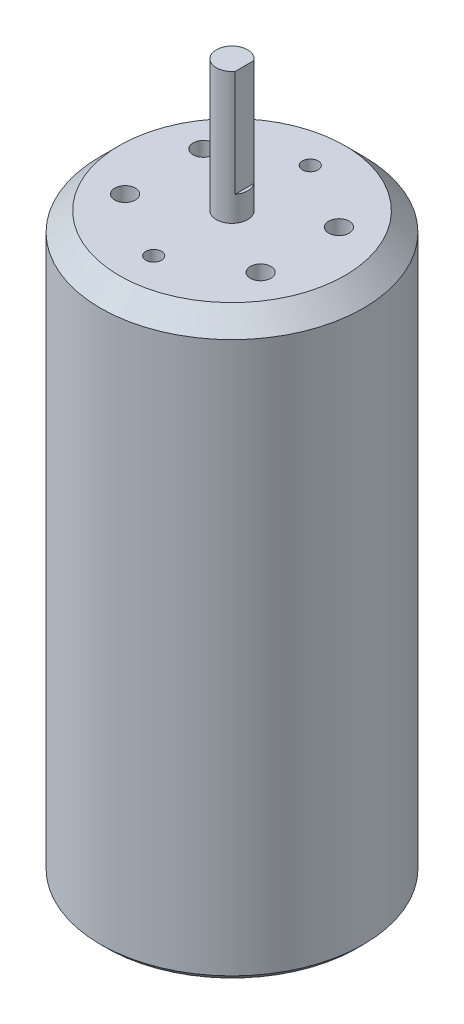
ISO-10303-21;
HEADER;
FILE_DESCRIPTION(('STEP AP214'),'2;1');
FILE_NAME('part.step','',(''),(''),'','','');
FILE_SCHEMA(('AUTOMOTIVE_DESIGN { 1 0 10303 214 1 1 1 1 }'));
ENDSEC;
DATA;
#1=APPLICATION_CONTEXT('core data for automotive mechanical design processes');
#2=APPLICATION_PROTOCOL_DEFINITION('international standard','automotive_design',2000,#1);
#3=PRODUCT_CONTEXT('',#1,'mechanical');
#4=PRODUCT('Part','Part','',(#3));
#5=PRODUCT_RELATED_PRODUCT_CATEGORY('part','',(#4));
#6=PRODUCT_DEFINITION_FORMATION('','',#4);
#7=PRODUCT_DEFINITION_CONTEXT('part definition',#1,'design');
#8=PRODUCT_DEFINITION('design','',#6,#7);
#9=PRODUCT_DEFINITION_SHAPE('','',#8);
#10=(LENGTH_UNIT() NAMED_UNIT(*) SI_UNIT(.MILLI.,.METRE.));
#11=(NAMED_UNIT(*) PLANE_ANGLE_UNIT() SI_UNIT($,.RADIAN.));
#12=(NAMED_UNIT(*) SI_UNIT($,.STERADIAN.) SOLID_ANGLE_UNIT());
#13=UNCERTAINTY_MEASURE_WITH_UNIT(LENGTH_MEASURE(1.E-05),#10,'distance_accuracy_value','');
#14=(GEOMETRIC_REPRESENTATION_CONTEXT(3) GLOBAL_UNCERTAINTY_ASSIGNED_CONTEXT((#13)) GLOBAL_UNIT_ASSIGNED_CONTEXT((#10,
#11,#12)) REPRESENTATION_CONTEXT('',''));
#15=CARTESIAN_POINT('',(0.,0.,0.));
#16=DIRECTION('',(0.,0.,1.));
#17=DIRECTION('',(1.,0.,0.));
#18=AXIS2_PLACEMENT_3D('',#15,#16,#17);
#19=CARTESIAN_POINT('',(0.,0.,0.));
#20=DIRECTION('',(0.,-1.,0.));
#21=DIRECTION('',(0.,0.,-1.));
#22=AXIS2_PLACEMENT_3D('',#19,#20,#21);
#23=CYLINDRICAL_SURFACE('',#22,2.5);
#24=CARTESIAN_POINT('',(0.,92.,0.));
#25=DIRECTION('',(0.,-1.,0.));
#26=DIRECTION('',(0.,0.,-1.));
#27=AXIS2_PLACEMENT_3D('',#24,#25,#26);
#28=CIRCLE('',#27,2.5);
#29=CARTESIAN_POINT('',(0.,92.,-2.5));
#30=VERTEX_POINT('',#29);
#31=EDGE_CURVE('E164',#30,#30,#28,.T.);
#32=ORIENTED_EDGE('',*,*,#31,.F.);
#33=EDGE_LOOP('',(#32));
#34=FACE_BOUND('',#33,.T.);
#35=CARTESIAN_POINT('',(0.,96.,0.));
#36=DIRECTION('',(0.,1.,0.));
#37=DIRECTION('',(0.,0.,1.));
#38=AXIS2_PLACEMENT_3D('',#35,#36,#37);
#39=CIRCLE('',#38,2.5);
#40=CARTESIAN_POINT('',(2.,96.,1.5));
#41=VERTEX_POINT('',#40);
#42=CARTESIAN_POINT('',(2.,96.,-1.5));
#43=VERTEX_POINT('',#42);
#44=EDGE_CURVE('E66',#41,#43,#39,.T.);
#45=ORIENTED_EDGE('',*,*,#44,.F.);
#46=DIRECTION('',(0.,1.,0.));
#47=VECTOR('',#46,1.);
#48=CARTESIAN_POINT('',(2.,96.,1.5));
#49=LINE('',#48,#47);
#50=CARTESIAN_POINT('',(2.,113.,1.5));
#51=VERTEX_POINT('',#50);
#52=EDGE_CURVE('E161',#41,#51,#49,.T.);
#53=ORIENTED_EDGE('',*,*,#52,.T.);
#54=CARTESIAN_POINT('',(0.,113.,0.));
#55=DIRECTION('',(0.,-1.,0.));
#56=DIRECTION('',(0.,0.,-1.));
#57=AXIS2_PLACEMENT_3D('',#54,#55,#56);
#58=CIRCLE('',#57,2.5);
#59=CARTESIAN_POINT('',(2.,113.,-1.5));
#60=VERTEX_POINT('',#59);
#61=EDGE_CURVE('E174',#51,#60,#58,.T.);
#62=ORIENTED_EDGE('',*,*,#61,.T.);
#63=DIRECTION('',(0.,1.,0.));
#64=VECTOR('',#63,1.);
#65=CARTESIAN_POINT('',(2.,96.,-1.5));
#66=LINE('',#65,#64);
#67=EDGE_CURVE('E76',#43,#60,#66,.T.);
#68=ORIENTED_EDGE('',*,*,#67,.F.);
#69=EDGE_LOOP('',(#45,#53,#62,#68));
#70=FACE_BOUND('',#69,.T.);
#71=ADVANCED_FACE('F46',(#34,#70),#23,.T.);
#72=CARTESIAN_POINT('',(21.,0.,0.));
#73=DIRECTION('',(0.,-1.,0.));
#74=DIRECTION('',(0.,0.,-1.));
#75=AXIS2_PLACEMENT_3D('',#72,#73,#74);
#76=PLANE('',#75);
#77=CARTESIAN_POINT('',(0.,0.,0.));
#78=DIRECTION('',(0.,-1.,0.));
#79=DIRECTION('',(0.,0.,-1.));
#80=AXIS2_PLACEMENT_3D('',#77,#78,#79);
#81=CIRCLE('',#80,20.);
#82=CARTESIAN_POINT('',(0.,0.,-20.));
#83=VERTEX_POINT('',#82);
#84=EDGE_CURVE('E57',#83,#83,#81,.T.);
#85=ORIENTED_EDGE('',*,*,#84,.T.);
#86=EDGE_LOOP('',(#85));
#87=FACE_BOUND('',#86,.T.);
#88=ADVANCED_FACE('F189',(#87),#76,.T.);
#89=CARTESIAN_POINT('',(0.,113.,0.));
#90=DIRECTION('',(0.,1.,0.));
#91=DIRECTION('',(0.,0.,1.));
#92=AXIS2_PLACEMENT_3D('',#89,#90,#91);
#93=PLANE('',#92);
#94=DIRECTION('',(0.,0.,1.));
#95=VECTOR('',#94,1.);
#96=CARTESIAN_POINT('',(2.,113.,1.5));
#97=LINE('',#96,#95);
#98=EDGE_CURVE('E152',#60,#51,#97,.T.);
#99=ORIENTED_EDGE('',*,*,#98,.F.);
#100=ORIENTED_EDGE('',*,*,#61,.F.);
#101=EDGE_LOOP('',(#99,#100));
#102=FACE_BOUND('',#101,.T.);
#103=ADVANCED_FACE('F204',(#102),#93,.T.);
#104=CARTESIAN_POINT('',(2.5,92.,0.));
#105=DIRECTION('',(0.,1.,0.));
#106=DIRECTION('',(0.,0.,1.));
#107=AXIS2_PLACEMENT_3D('',#104,#105,#106);
#108=PLANE('',#107);
#109=CARTESIAN_POINT('',(0.,92.,0.));
#110=DIRECTION('',(0.,1.,0.));
#111=DIRECTION('',(0.,0.,1.));
#112=AXIS2_PLACEMENT_3D('',#109,#110,#111);
#113=CIRCLE('',#112,18.);
#114=CARTESIAN_POINT('',(0.,92.,18.));
#115=VERTEX_POINT('',#114);
#116=EDGE_CURVE('E178',#115,#115,#113,.T.);
#117=ORIENTED_EDGE('',*,*,#116,.T.);
#118=EDGE_LOOP('',(#117));
#119=FACE_BOUND('',#118,.T.);
#120=CARTESIAN_POINT('',(-10.8253175473055,92.,-6.25000000000002));
#121=DIRECTION('',(0.,1.,0.));
#122=DIRECTION('',(0.,0.,1.));
#123=AXIS2_PLACEMENT_3D('',#120,#121,#122);
#124=CIRCLE('',#123,1.65);
#125=CARTESIAN_POINT('',(-10.8253175473055,92.,-4.60000000000002));
#126=VERTEX_POINT('',#125);
#127=EDGE_CURVE('E108',#126,#126,#124,.T.);
#128=ORIENTED_EDGE('',*,*,#127,.F.);
#129=EDGE_LOOP('',(#128));
#130=FACE_BOUND('',#129,.T.);
#131=CARTESIAN_POINT('',(-10.8253175473055,92.,6.25000000000002));
#132=DIRECTION('',(0.,1.,0.));
#133=DIRECTION('',(0.,0.,1.));
#134=AXIS2_PLACEMENT_3D('',#131,#132,#133);
#135=CIRCLE('',#134,1.65);
#136=CARTESIAN_POINT('',(-10.8253175473055,92.,7.90000000000001));
#137=VERTEX_POINT('',#136);
#138=EDGE_CURVE('E107',#137,#137,#135,.T.);
#139=ORIENTED_EDGE('',*,*,#138,.F.);
#140=EDGE_LOOP('',(#139));
#141=FACE_BOUND('',#140,.T.);
#142=CARTESIAN_POINT('',(10.8253175473055,92.,6.25000000000002));
#143=DIRECTION('',(0.,1.,0.));
#144=DIRECTION('',(0.,0.,1.));
#145=AXIS2_PLACEMENT_3D('',#142,#143,#144);
#146=CIRCLE('',#145,1.65);
#147=CARTESIAN_POINT('',(10.8253175473055,92.,7.90000000000001));
#148=VERTEX_POINT('',#147);
#149=EDGE_CURVE('E121',#148,#148,#146,.T.);
#150=ORIENTED_EDGE('',*,*,#149,.F.);
#151=EDGE_LOOP('',(#150));
#152=FACE_BOUND('',#151,.T.);
#153=CARTESIAN_POINT('',(10.8253175473055,92.,-6.25000000000002));
#154=DIRECTION('',(0.,1.,0.));
#155=DIRECTION('',(0.,0.,1.));
#156=AXIS2_PLACEMENT_3D('',#153,#154,#155);
#157=CIRCLE('',#156,1.65);
#158=CARTESIAN_POINT('',(10.8253175473055,92.,-4.60000000000002));
#159=VERTEX_POINT('',#158);
#160=EDGE_CURVE('E128',#159,#159,#157,.T.);
#161=ORIENTED_EDGE('',*,*,#160,.F.);
#162=EDGE_LOOP('',(#161));
#163=FACE_BOUND('',#162,.T.);
#164=CARTESIAN_POINT('',(0.,92.,-12.5));
#165=DIRECTION('',(0.,1.,0.));
#166=DIRECTION('',(0.,0.,1.));
#167=AXIS2_PLACEMENT_3D('',#164,#165,#166);
#168=CIRCLE('',#167,1.24999999999999);
#169=CARTESIAN_POINT('',(0.,92.,-11.25));
#170=VERTEX_POINT('',#169);
#171=EDGE_CURVE('E140',#170,#170,#168,.T.);
#172=ORIENTED_EDGE('',*,*,#171,.F.);
#173=EDGE_LOOP('',(#172));
#174=FACE_BOUND('',#173,.T.);
#175=CARTESIAN_POINT('',(0.,92.,12.5));
#176=DIRECTION('',(0.,1.,0.));
#177=DIRECTION('',(0.,0.,1.));
#178=AXIS2_PLACEMENT_3D('',#175,#176,#177);
#179=CIRCLE('',#178,1.24999999999999);
#180=CARTESIAN_POINT('',(0.,92.,13.75));
#181=VERTEX_POINT('',#180);
#182=EDGE_CURVE('E148',#181,#181,#179,.T.);
#183=ORIENTED_EDGE('',*,*,#182,.F.);
#184=EDGE_LOOP('',(#183));
#185=FACE_BOUND('',#184,.T.);
#186=ORIENTED_EDGE('',*,*,#31,.T.);
#187=EDGE_LOOP('',(#186));
#188=FACE_BOUND('',#187,.T.);
#189=ADVANCED_FACE('F209',(#119,#130,#141,#152,#163,#174,#185,#188),#108,.T.);
#190=CARTESIAN_POINT('',(0.,0.,0.));
#191=DIRECTION('',(0.,-1.,0.));
#192=DIRECTION('',(0.,0.,-1.));
#193=AXIS2_PLACEMENT_3D('',#190,#191,#192);
#194=CYLINDRICAL_SURFACE('',#193,21.);
#195=CARTESIAN_POINT('',(0.,1.,0.));
#196=DIRECTION('',(0.,-1.,0.));
#197=DIRECTION('',(0.,0.,-1.));
#198=AXIS2_PLACEMENT_3D('',#195,#196,#197);
#199=CIRCLE('',#198,21.);
#200=CARTESIAN_POINT('',(0.,1.,-21.));
#201=VERTEX_POINT('',#200);
#202=EDGE_CURVE('E11',#201,#201,#199,.F.);
#203=ORIENTED_EDGE('',*,*,#202,.T.);
#204=EDGE_LOOP('',(#203));
#205=FACE_BOUND('',#204,.T.);
#206=CARTESIAN_POINT('',(0.,89.,0.));
#207=DIRECTION('',(0.,1.,0.));
#208=DIRECTION('',(0.,0.,1.));
#209=AXIS2_PLACEMENT_3D('',#206,#207,#208);
#210=CIRCLE('',#209,21.);
#211=CARTESIAN_POINT('',(0.,89.,21.));
#212=VERTEX_POINT('',#211);
#213=EDGE_CURVE('E172',#212,#212,#210,.F.);
#214=ORIENTED_EDGE('',*,*,#213,.T.);
#215=EDGE_LOOP('',(#214));
#216=FACE_BOUND('',#215,.T.);
#217=ADVANCED_FACE('F225',(#205,#216),#194,.T.);
#218=CARTESIAN_POINT('',(2.,96.,1.5));
#219=DIRECTION('',(-1.,0.,0.));
#220=DIRECTION('',(0.,0.,1.));
#221=AXIS2_PLACEMENT_3D('',#218,#219,#220);
#222=PLANE('',#221);
#223=ORIENTED_EDGE('',*,*,#98,.T.);
#224=ORIENTED_EDGE('',*,*,#52,.F.);
#225=DIRECTION('',(0.,0.,1.));
#226=VECTOR('',#225,1.);
#227=CARTESIAN_POINT('',(2.,96.,1.5));
#228=LINE('',#227,#226);
#229=EDGE_CURVE('E61',#43,#41,#228,.T.);
#230=ORIENTED_EDGE('',*,*,#229,.F.);
#231=ORIENTED_EDGE('',*,*,#67,.T.);
#232=EDGE_LOOP('',(#223,#224,#230,#231));
#233=FACE_BOUND('',#232,.T.);
#234=ADVANCED_FACE('F223',(#233),#222,.F.);
#235=CARTESIAN_POINT('',(0.,96.,0.));
#236=DIRECTION('',(0.,1.,0.));
#237=DIRECTION('',(0.,0.,1.));
#238=AXIS2_PLACEMENT_3D('',#235,#236,#237);
#239=PLANE('',#238);
#240=ORIENTED_EDGE('',*,*,#44,.T.);
#241=ORIENTED_EDGE('',*,*,#229,.T.);
#242=EDGE_LOOP('',(#240,#241));
#243=FACE_BOUND('',#242,.T.);
#244=ADVANCED_FACE('F229',(#243),#239,.T.);
#245=CARTESIAN_POINT('',(0.,82.7510757737845,12.5));
#246=DIRECTION('',(0.,1.,0.));
#247=DIRECTION('',(0.,0.,1.));
#248=AXIS2_PLACEMENT_3D('',#245,#246,#247);
#249=CONICAL_SURFACE('',#248,1.25,1.02974425867666);
#250=CARTESIAN_POINT('',(0.,82.,12.5));
#251=VERTEX_POINT('',#250);
#252=VERTEX_LOOP('',#251);
#253=FACE_BOUND('',#252,.T.);
#254=CARTESIAN_POINT('',(0.,82.7510757737845,12.5));
#255=DIRECTION('',(0.,1.,0.));
#256=DIRECTION('',(0.,0.,1.));
#257=AXIS2_PLACEMENT_3D('',#254,#255,#256);
#258=CIRCLE('',#257,1.25);
#259=CARTESIAN_POINT('',(0.,82.7510757737845,13.75));
#260=VERTEX_POINT('',#259);
#261=EDGE_CURVE('E147',#260,#260,#258,.T.);
#262=ORIENTED_EDGE('',*,*,#261,.T.);
#263=EDGE_LOOP('',(#262));
#264=FACE_BOUND('',#263,.T.);
#265=ADVANCED_FACE('F234',(#253,#264),#249,.F.);
#266=CARTESIAN_POINT('',(0.,92.,12.5));
#267=DIRECTION('',(0.,1.,0.));
#268=DIRECTION('',(0.,0.,1.));
#269=AXIS2_PLACEMENT_3D('',#266,#267,#268);
#270=CYLINDRICAL_SURFACE('',#269,1.24999999999999);
#271=ORIENTED_EDGE('',*,*,#261,.F.);
#272=EDGE_LOOP('',(#271));
#273=FACE_BOUND('',#272,.T.);
#274=ORIENTED_EDGE('',*,*,#182,.T.);
#275=EDGE_LOOP('',(#274));
#276=FACE_BOUND('',#275,.T.);
#277=ADVANCED_FACE('F240',(#273,#276),#270,.F.);
#278=CARTESIAN_POINT('',(0.,82.7510757737845,-12.5));
#279=DIRECTION('',(0.,1.,0.));
#280=DIRECTION('',(0.,0.,1.));
#281=AXIS2_PLACEMENT_3D('',#278,#279,#280);
#282=CONICAL_SURFACE('',#281,1.25,1.02974425867666);
#283=CARTESIAN_POINT('',(0.,82.,-12.5));
#284=VERTEX_POINT('',#283);
#285=VERTEX_LOOP('',#284);
#286=FACE_BOUND('',#285,.T.);
#287=CARTESIAN_POINT('',(0.,82.7510757737845,-12.5));
#288=DIRECTION('',(0.,1.,0.));
#289=DIRECTION('',(0.,0.,1.));
#290=AXIS2_PLACEMENT_3D('',#287,#288,#289);
#291=CIRCLE('',#290,1.25);
#292=CARTESIAN_POINT('',(0.,82.7510757737845,-11.25));
#293=VERTEX_POINT('',#292);
#294=EDGE_CURVE('E142',#293,#293,#291,.T.);
#295=ORIENTED_EDGE('',*,*,#294,.T.);
#296=EDGE_LOOP('',(#295));
#297=FACE_BOUND('',#296,.T.);
#298=ADVANCED_FACE('F238',(#286,#297),#282,.F.);
#299=CARTESIAN_POINT('',(0.,92.,-12.5));
#300=DIRECTION('',(0.,1.,0.));
#301=DIRECTION('',(0.,0.,1.));
#302=AXIS2_PLACEMENT_3D('',#299,#300,#301);
#303=CYLINDRICAL_SURFACE('',#302,1.24999999999999);
#304=ORIENTED_EDGE('',*,*,#294,.F.);
#305=EDGE_LOOP('',(#304));
#306=FACE_BOUND('',#305,.T.);
#307=ORIENTED_EDGE('',*,*,#171,.T.);
#308=EDGE_LOOP('',(#307));
#309=FACE_BOUND('',#308,.T.);
#310=ADVANCED_FACE('F243',(#306,#309),#303,.F.);
#311=CARTESIAN_POINT('',(10.8253175473055,82.9914200213955,-6.25000000000002));
#312=DIRECTION('',(0.,1.,0.));
#313=DIRECTION('',(0.,0.,1.));
#314=AXIS2_PLACEMENT_3D('',#311,#312,#313);
#315=CONICAL_SURFACE('',#314,1.65,1.02974425867665);
#316=CARTESIAN_POINT('',(10.8253175473055,82.,-6.25000000000002));
#317=VERTEX_POINT('',#316);
#318=VERTEX_LOOP('',#317);
#319=FACE_BOUND('',#318,.T.);
#320=CARTESIAN_POINT('',(10.8253175473055,82.9914200213955,-6.25000000000002));
#321=DIRECTION('',(0.,1.,0.));
#322=DIRECTION('',(0.,0.,1.));
#323=AXIS2_PLACEMENT_3D('',#320,#321,#322);
#324=CIRCLE('',#323,1.65);
#325=CARTESIAN_POINT('',(10.8253175473055,82.9914200213955,-4.60000000000002));
#326=VERTEX_POINT('',#325);
#327=EDGE_CURVE('E133',#326,#326,#324,.T.);
#328=ORIENTED_EDGE('',*,*,#327,.T.);
#329=EDGE_LOOP('',(#328));
#330=FACE_BOUND('',#329,.T.);
#331=ADVANCED_FACE('F246',(#319,#330),#315,.F.);
#332=CARTESIAN_POINT('',(10.8253175473055,92.,-6.25000000000002));
#333=DIRECTION('',(0.,1.,0.));
#334=DIRECTION('',(0.,0.,1.));
#335=AXIS2_PLACEMENT_3D('',#332,#333,#334);
#336=CYLINDRICAL_SURFACE('',#335,1.65);
#337=ORIENTED_EDGE('',*,*,#327,.F.);
#338=EDGE_LOOP('',(#337));
#339=FACE_BOUND('',#338,.T.);
#340=ORIENTED_EDGE('',*,*,#160,.T.);
#341=EDGE_LOOP('',(#340));
#342=FACE_BOUND('',#341,.T.);
#343=ADVANCED_FACE('F253',(#339,#342),#336,.F.);
#344=CARTESIAN_POINT('',(10.8253175473055,82.9914200213955,6.25000000000002));
#345=DIRECTION('',(0.,1.,0.));
#346=DIRECTION('',(0.,0.,1.));
#347=AXIS2_PLACEMENT_3D('',#344,#345,#346);
#348=CONICAL_SURFACE('',#347,1.65,1.02974425867665);
#349=CARTESIAN_POINT('',(10.8253175473055,82.,6.25000000000002));
#350=VERTEX_POINT('',#349);
#351=VERTEX_LOOP('',#350);
#352=FACE_BOUND('',#351,.T.);
#353=CARTESIAN_POINT('',(10.8253175473055,82.9914200213955,6.25000000000002));
#354=DIRECTION('',(0.,1.,0.));
#355=DIRECTION('',(0.,0.,1.));
#356=AXIS2_PLACEMENT_3D('',#353,#354,#355);
#357=CIRCLE('',#356,1.65);
#358=CARTESIAN_POINT('',(10.8253175473055,82.9914200213955,7.90000000000001));
#359=VERTEX_POINT('',#358);
#360=EDGE_CURVE('E127',#359,#359,#357,.T.);
#361=ORIENTED_EDGE('',*,*,#360,.T.);
#362=EDGE_LOOP('',(#361));
#363=FACE_BOUND('',#362,.T.);
#364=ADVANCED_FACE('F254',(#352,#363),#348,.F.);
#365=CARTESIAN_POINT('',(10.8253175473055,92.,6.25000000000002));
#366=DIRECTION('',(0.,1.,0.));
#367=DIRECTION('',(0.,0.,1.));
#368=AXIS2_PLACEMENT_3D('',#365,#366,#367);
#369=CYLINDRICAL_SURFACE('',#368,1.65);
#370=ORIENTED_EDGE('',*,*,#360,.F.);
#371=EDGE_LOOP('',(#370));
#372=FACE_BOUND('',#371,.T.);
#373=ORIENTED_EDGE('',*,*,#149,.T.);
#374=EDGE_LOOP('',(#373));
#375=FACE_BOUND('',#374,.T.);
#376=ADVANCED_FACE('F259',(#372,#375),#369,.F.);
#377=CARTESIAN_POINT('',(-10.8253175473055,82.9914200213955,6.25000000000002));
#378=DIRECTION('',(0.,1.,0.));
#379=DIRECTION('',(0.,0.,1.));
#380=AXIS2_PLACEMENT_3D('',#377,#378,#379);
#381=CONICAL_SURFACE('',#380,1.65,1.02974425867665);
#382=CARTESIAN_POINT('',(-10.8253175473055,82.,6.25000000000002));
#383=VERTEX_POINT('',#382);
#384=VERTEX_LOOP('',#383);
#385=FACE_BOUND('',#384,.T.);
#386=CARTESIAN_POINT('',(-10.8253175473055,82.9914200213955,6.25000000000002));
#387=DIRECTION('',(0.,1.,0.));
#388=DIRECTION('',(0.,0.,1.));
#389=AXIS2_PLACEMENT_3D('',#386,#387,#388);
#390=CIRCLE('',#389,1.65);
#391=CARTESIAN_POINT('',(-10.8253175473055,82.9914200213955,7.90000000000001));
#392=VERTEX_POINT('',#391);
#393=EDGE_CURVE('E111',#392,#392,#390,.T.);
#394=ORIENTED_EDGE('',*,*,#393,.T.);
#395=EDGE_LOOP('',(#394));
#396=FACE_BOUND('',#395,.T.);
#397=ADVANCED_FACE('F263',(#385,#396),#381,.F.);
#398=CARTESIAN_POINT('',(-10.8253175473055,92.,6.25000000000002));
#399=DIRECTION('',(0.,1.,0.));
#400=DIRECTION('',(0.,0.,1.));
#401=AXIS2_PLACEMENT_3D('',#398,#399,#400);
#402=CYLINDRICAL_SURFACE('',#401,1.65);
#403=ORIENTED_EDGE('',*,*,#393,.F.);
#404=EDGE_LOOP('',(#403));
#405=FACE_BOUND('',#404,.T.);
#406=ORIENTED_EDGE('',*,*,#138,.T.);
#407=EDGE_LOOP('',(#406));
#408=FACE_BOUND('',#407,.T.);
#409=ADVANCED_FACE('F101',(#405,#408),#402,.F.);
#410=CARTESIAN_POINT('',(-10.8253175473055,82.9914200213955,-6.25000000000002));
#411=DIRECTION('',(0.,1.,0.));
#412=DIRECTION('',(0.,0.,1.));
#413=AXIS2_PLACEMENT_3D('',#410,#411,#412);
#414=CONICAL_SURFACE('',#413,1.65,1.02974425867665);
#415=CARTESIAN_POINT('',(-10.8253175473055,82.,-6.25000000000002));
#416=VERTEX_POINT('',#415);
#417=VERTEX_LOOP('',#416);
#418=FACE_BOUND('',#417,.T.);
#419=CARTESIAN_POINT('',(-10.8253175473055,82.9914200213955,-6.25000000000002));
#420=DIRECTION('',(0.,1.,0.));
#421=DIRECTION('',(0.,0.,1.));
#422=AXIS2_PLACEMENT_3D('',#419,#420,#421);
#423=CIRCLE('',#422,1.65);
#424=CARTESIAN_POINT('',(-10.8253175473055,82.9914200213955,-4.60000000000002));
#425=VERTEX_POINT('',#424);
#426=EDGE_CURVE('E104',#425,#425,#423,.T.);
#427=ORIENTED_EDGE('',*,*,#426,.T.);
#428=EDGE_LOOP('',(#427));
#429=FACE_BOUND('',#428,.T.);
#430=ADVANCED_FACE('F100',(#418,#429),#414,.F.);
#431=CARTESIAN_POINT('',(-10.8253175473055,92.,-6.25000000000002));
#432=DIRECTION('',(0.,1.,0.));
#433=DIRECTION('',(0.,0.,1.));
#434=AXIS2_PLACEMENT_3D('',#431,#432,#433);
#435=CYLINDRICAL_SURFACE('',#434,1.65);
#436=ORIENTED_EDGE('',*,*,#426,.F.);
#437=EDGE_LOOP('',(#436));
#438=FACE_BOUND('',#437,.T.);
#439=ORIENTED_EDGE('',*,*,#127,.T.);
#440=EDGE_LOOP('',(#439));
#441=FACE_BOUND('',#440,.T.);
#442=ADVANCED_FACE('F99',(#438,#441),#435,.F.);
#443=CARTESIAN_POINT('',(0.,89.,0.));
#444=DIRECTION('',(0.,-1.,0.));
#445=DIRECTION('',(0.,0.,-1.));
#446=AXIS2_PLACEMENT_3D('',#443,#444,#445);
#447=CONICAL_SURFACE('',#446,21.,0.78539816339745);
#448=ORIENTED_EDGE('',*,*,#116,.F.);
#449=EDGE_LOOP('',(#448));
#450=FACE_BOUND('',#449,.T.);
#451=ORIENTED_EDGE('',*,*,#213,.F.);
#452=EDGE_LOOP('',(#451));
#453=FACE_BOUND('',#452,.T.);
#454=ADVANCED_FACE('F188',(#450,#453),#447,.T.);
#455=CARTESIAN_POINT('',(0.,0.,0.));
#456=DIRECTION('',(0.,1.,0.));
#457=DIRECTION('',(0.,0.,1.));
#458=AXIS2_PLACEMENT_3D('',#455,#456,#457);
#459=CONICAL_SURFACE('',#458,20.,0.785398163397445);
#460=ORIENTED_EDGE('',*,*,#202,.F.);
#461=EDGE_LOOP('',(#460));
#462=FACE_BOUND('',#461,.T.);
#463=ORIENTED_EDGE('',*,*,#84,.F.);
#464=EDGE_LOOP('',(#463));
#465=FACE_BOUND('',#464,.T.);
#466=ADVANCED_FACE('F47',(#462,#465),#459,.T.);
#467=CLOSED_SHELL('',(#71,#88,#103,#189,#217,#234,#244,#265,#277,#298,#310,#331,#343,#364,#376,
#397,#409,#430,#442,#454,#466));
#468=MANIFOLD_SOLID_BREP('B2',#467);
#469=ADVANCED_BREP_SHAPE_REPRESENTATION('',(#18,#468),#14);
#470=SHAPE_DEFINITION_REPRESENTATION(#9,#469);
ENDSEC;
END-ISO-10303-21;
